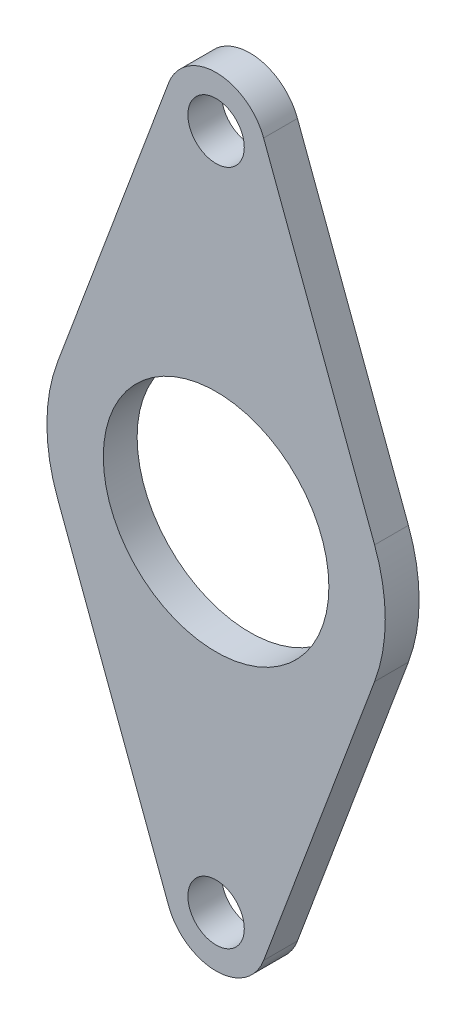
ISO-10303-21;
HEADER;
FILE_DESCRIPTION(('STEP AP214'),'2;1');
FILE_NAME('part.step','',(''),(''),'','','');
FILE_SCHEMA(('AUTOMOTIVE_DESIGN { 1 0 10303 214 1 1 1 1 }'));
ENDSEC;
DATA;
#1=APPLICATION_CONTEXT('core data for automotive mechanical design processes');
#2=APPLICATION_PROTOCOL_DEFINITION('international standard','automotive_design',2000,#1);
#3=PRODUCT_CONTEXT('',#1,'mechanical');
#4=PRODUCT('Part','Part','',(#3));
#5=PRODUCT_RELATED_PRODUCT_CATEGORY('part','',(#4));
#6=PRODUCT_DEFINITION_FORMATION('','',#4);
#7=PRODUCT_DEFINITION_CONTEXT('part definition',#1,'design');
#8=PRODUCT_DEFINITION('design','',#6,#7);
#9=PRODUCT_DEFINITION_SHAPE('','',#8);
#10=(LENGTH_UNIT() NAMED_UNIT(*) SI_UNIT(.MILLI.,.METRE.));
#11=(NAMED_UNIT(*) PLANE_ANGLE_UNIT() SI_UNIT($,.RADIAN.));
#12=(NAMED_UNIT(*) SI_UNIT($,.STERADIAN.) SOLID_ANGLE_UNIT());
#13=UNCERTAINTY_MEASURE_WITH_UNIT(LENGTH_MEASURE(1.E-05),#10,'distance_accuracy_value','');
#14=(GEOMETRIC_REPRESENTATION_CONTEXT(3) GLOBAL_UNCERTAINTY_ASSIGNED_CONTEXT((#13)) GLOBAL_UNIT_ASSIGNED_CONTEXT((#10,
#11,#12)) REPRESENTATION_CONTEXT('',''));
#15=CARTESIAN_POINT('',(0.,0.,0.));
#16=DIRECTION('',(0.,0.,1.));
#17=DIRECTION('',(1.,0.,0.));
#18=AXIS2_PLACEMENT_3D('',#15,#16,#17);
#19=CARTESIAN_POINT('',(0.,-30.,3.));
#20=DIRECTION('',(0.,0.,1.));
#21=DIRECTION('',(1.,0.,0.));
#22=AXIS2_PLACEMENT_3D('',#19,#20,#21);
#23=PLANE('',#22);
#24=CARTESIAN_POINT('',(0.,-30.,3.));
#25=DIRECTION('',(0.,0.,1.));
#26=DIRECTION('',(1.,0.,0.));
#27=AXIS2_PLACEMENT_3D('',#24,#25,#26);
#28=CIRCLE('',#27,2.5);
#29=CARTESIAN_POINT('',(2.5,-30.,3.));
#30=VERTEX_POINT('',#29);
#31=EDGE_CURVE('E184',#30,#30,#28,.T.);
#32=ORIENTED_EDGE('',*,*,#31,.F.);
#33=EDGE_LOOP('',(#32));
#34=FACE_BOUND('',#33,.T.);
#35=CARTESIAN_POINT('',(0.,-30.,3.));
#36=DIRECTION('',(0.,0.,1.));
#37=DIRECTION('',(1.,0.,0.));
#38=AXIS2_PLACEMENT_3D('',#35,#36,#37);
#39=CIRCLE('',#38,4.5);
#40=CARTESIAN_POINT('',(-4.21537364891892,-31.575,3.));
#41=VERTEX_POINT('',#40);
#42=CARTESIAN_POINT('',(4.21537364891892,-31.575,3.));
#43=VERTEX_POINT('',#42);
#44=EDGE_CURVE('E147',#41,#43,#39,.T.);
#45=ORIENTED_EDGE('',*,*,#44,.T.);
#46=DIRECTION('',(0.35,0.93674969975976,0.));
#47=VECTOR('',#46,1.);
#48=CARTESIAN_POINT('',(4.21537364891892,-31.575,3.));
#49=LINE('',#48,#47);
#50=CARTESIAN_POINT('',(14.0512454963964,-5.25,3.));
#51=VERTEX_POINT('',#50);
#52=EDGE_CURVE('E95',#43,#51,#49,.T.);
#53=ORIENTED_EDGE('',*,*,#52,.T.);
#54=CARTESIAN_POINT('',(0.,0.,3.));
#55=DIRECTION('',(0.,0.,1.));
#56=DIRECTION('',(1.,0.,0.));
#57=AXIS2_PLACEMENT_3D('',#54,#55,#56);
#58=CIRCLE('',#57,15.);
#59=CARTESIAN_POINT('',(14.0512454963964,5.25,3.));
#60=VERTEX_POINT('',#59);
#61=EDGE_CURVE('E162',#51,#60,#58,.T.);
#62=ORIENTED_EDGE('',*,*,#61,.T.);
#63=DIRECTION('',(-0.35,0.93674969975976,0.));
#64=VECTOR('',#63,1.);
#65=CARTESIAN_POINT('',(4.21537364891892,31.575,3.));
#66=LINE('',#65,#64);
#67=CARTESIAN_POINT('',(4.21537364891892,31.575,3.));
#68=VERTEX_POINT('',#67);
#69=EDGE_CURVE('E175',#60,#68,#66,.T.);
#70=ORIENTED_EDGE('',*,*,#69,.T.);
#71=CARTESIAN_POINT('',(0.,30.,3.));
#72=DIRECTION('',(0.,0.,1.));
#73=DIRECTION('',(1.,0.,0.));
#74=AXIS2_PLACEMENT_3D('',#71,#72,#73);
#75=CIRCLE('',#74,4.5);
#76=CARTESIAN_POINT('',(-4.21537364891891,31.575,3.));
#77=VERTEX_POINT('',#76);
#78=EDGE_CURVE('E114',#68,#77,#75,.T.);
#79=ORIENTED_EDGE('',*,*,#78,.T.);
#80=DIRECTION('',(-0.35,-0.93674969975976,0.));
#81=VECTOR('',#80,1.);
#82=CARTESIAN_POINT('',(-4.21537364891892,31.575,3.));
#83=LINE('',#82,#81);
#84=CARTESIAN_POINT('',(-14.0512454963964,5.25,3.));
#85=VERTEX_POINT('',#84);
#86=EDGE_CURVE('E108',#77,#85,#83,.T.);
#87=ORIENTED_EDGE('',*,*,#86,.T.);
#88=CARTESIAN_POINT('',(0.,0.,3.));
#89=DIRECTION('',(0.,0.,1.));
#90=DIRECTION('',(1.,0.,0.));
#91=AXIS2_PLACEMENT_3D('',#88,#89,#90);
#92=CIRCLE('',#91,15.);
#93=CARTESIAN_POINT('',(-14.0512454963964,-5.24999999999999,3.));
#94=VERTEX_POINT('',#93);
#95=EDGE_CURVE('E112',#85,#94,#92,.T.);
#96=ORIENTED_EDGE('',*,*,#95,.T.);
#97=DIRECTION('',(0.35,-0.93674969975976,0.));
#98=VECTOR('',#97,1.);
#99=CARTESIAN_POINT('',(-4.21537364891892,-31.575,3.));
#100=LINE('',#99,#98);
#101=EDGE_CURVE('E52',#94,#41,#100,.T.);
#102=ORIENTED_EDGE('',*,*,#101,.T.);
#103=EDGE_LOOP('',(#45,#53,#62,#70,#79,#87,#96,#102));
#104=FACE_BOUND('',#103,.T.);
#105=CARTESIAN_POINT('',(0.,30.,3.));
#106=DIRECTION('',(0.,0.,1.));
#107=DIRECTION('',(1.,0.,0.));
#108=AXIS2_PLACEMENT_3D('',#105,#106,#107);
#109=CIRCLE('',#108,2.5);
#110=CARTESIAN_POINT('',(2.50000000000001,30.,3.));
#111=VERTEX_POINT('',#110);
#112=EDGE_CURVE('E136',#111,#111,#109,.T.);
#113=ORIENTED_EDGE('',*,*,#112,.F.);
#114=EDGE_LOOP('',(#113));
#115=FACE_BOUND('',#114,.T.);
#116=CARTESIAN_POINT('',(0.,0.,3.));
#117=DIRECTION('',(0.,0.,1.));
#118=DIRECTION('',(1.,0.,0.));
#119=AXIS2_PLACEMENT_3D('',#116,#117,#118);
#120=CIRCLE('',#119,10.);
#121=CARTESIAN_POINT('',(10.,0.,3.));
#122=VERTEX_POINT('',#121);
#123=EDGE_CURVE('E190',#122,#122,#120,.T.);
#124=ORIENTED_EDGE('',*,*,#123,.F.);
#125=EDGE_LOOP('',(#124));
#126=FACE_BOUND('',#125,.T.);
#127=ADVANCED_FACE('F35',(#34,#104,#115,#126),#23,.T.);
#128=CARTESIAN_POINT('',(0.,-30.,0.));
#129=DIRECTION('',(0.,0.,1.));
#130=DIRECTION('',(1.,0.,0.));
#131=AXIS2_PLACEMENT_3D('',#128,#129,#130);
#132=PLANE('',#131);
#133=CARTESIAN_POINT('',(0.,-30.,0.));
#134=DIRECTION('',(0.,0.,1.));
#135=DIRECTION('',(1.,0.,0.));
#136=AXIS2_PLACEMENT_3D('',#133,#134,#135);
#137=CIRCLE('',#136,4.5);
#138=CARTESIAN_POINT('',(-4.21537364891892,-31.575,0.));
#139=VERTEX_POINT('',#138);
#140=CARTESIAN_POINT('',(4.21537364891892,-31.575,0.));
#141=VERTEX_POINT('',#140);
#142=EDGE_CURVE('E132',#139,#141,#137,.T.);
#143=ORIENTED_EDGE('',*,*,#142,.F.);
#144=DIRECTION('',(0.35,-0.93674969975976,0.));
#145=VECTOR('',#144,1.);
#146=CARTESIAN_POINT('',(-4.21537364891892,-31.575,0.));
#147=LINE('',#146,#145);
#148=CARTESIAN_POINT('',(-14.0512454963964,-5.24999999999999,0.));
#149=VERTEX_POINT('',#148);
#150=EDGE_CURVE('E87',#149,#139,#147,.T.);
#151=ORIENTED_EDGE('',*,*,#150,.F.);
#152=CARTESIAN_POINT('',(0.,0.,0.));
#153=DIRECTION('',(0.,0.,1.));
#154=DIRECTION('',(1.,0.,0.));
#155=AXIS2_PLACEMENT_3D('',#152,#153,#154);
#156=CIRCLE('',#155,15.);
#157=CARTESIAN_POINT('',(-14.0512454963964,5.25,0.));
#158=VERTEX_POINT('',#157);
#159=EDGE_CURVE('E81',#158,#149,#156,.T.);
#160=ORIENTED_EDGE('',*,*,#159,.F.);
#161=DIRECTION('',(-0.35,-0.93674969975976,0.));
#162=VECTOR('',#161,1.);
#163=CARTESIAN_POINT('',(-4.21537364891892,31.575,0.));
#164=LINE('',#163,#162);
#165=CARTESIAN_POINT('',(-4.21537364891891,31.575,0.));
#166=VERTEX_POINT('',#165);
#167=EDGE_CURVE('E122',#166,#158,#164,.T.);
#168=ORIENTED_EDGE('',*,*,#167,.F.);
#169=CARTESIAN_POINT('',(0.,30.,0.));
#170=DIRECTION('',(0.,0.,1.));
#171=DIRECTION('',(1.,0.,0.));
#172=AXIS2_PLACEMENT_3D('',#169,#170,#171);
#173=CIRCLE('',#172,4.5);
#174=CARTESIAN_POINT('',(4.21537364891892,31.575,0.));
#175=VERTEX_POINT('',#174);
#176=EDGE_CURVE('E142',#175,#166,#173,.T.);
#177=ORIENTED_EDGE('',*,*,#176,.F.);
#178=DIRECTION('',(-0.35,0.93674969975976,0.));
#179=VECTOR('',#178,1.);
#180=CARTESIAN_POINT('',(4.21537364891892,31.575,0.));
#181=LINE('',#180,#179);
#182=CARTESIAN_POINT('',(14.0512454963964,5.25,0.));
#183=VERTEX_POINT('',#182);
#184=EDGE_CURVE('E140',#183,#175,#181,.T.);
#185=ORIENTED_EDGE('',*,*,#184,.F.);
#186=CARTESIAN_POINT('',(0.,0.,0.));
#187=DIRECTION('',(0.,0.,1.));
#188=DIRECTION('',(1.,0.,0.));
#189=AXIS2_PLACEMENT_3D('',#186,#187,#188);
#190=CIRCLE('',#189,15.);
#191=CARTESIAN_POINT('',(14.0512454963964,-5.25,0.));
#192=VERTEX_POINT('',#191);
#193=EDGE_CURVE('E138',#192,#183,#190,.T.);
#194=ORIENTED_EDGE('',*,*,#193,.F.);
#195=DIRECTION('',(0.35,0.93674969975976,0.));
#196=VECTOR('',#195,1.);
#197=CARTESIAN_POINT('',(4.21537364891892,-31.575,0.));
#198=LINE('',#197,#196);
#199=EDGE_CURVE('E135',#141,#192,#198,.T.);
#200=ORIENTED_EDGE('',*,*,#199,.F.);
#201=EDGE_LOOP('',(#143,#151,#160,#168,#177,#185,#194,#200));
#202=FACE_BOUND('',#201,.T.);
#203=CARTESIAN_POINT('',(0.,30.,0.));
#204=DIRECTION('',(0.,0.,1.));
#205=DIRECTION('',(1.,0.,0.));
#206=AXIS2_PLACEMENT_3D('',#203,#204,#205);
#207=CIRCLE('',#206,2.5);
#208=CARTESIAN_POINT('',(2.50000000000001,30.,0.));
#209=VERTEX_POINT('',#208);
#210=EDGE_CURVE('E181',#209,#209,#207,.T.);
#211=ORIENTED_EDGE('',*,*,#210,.T.);
#212=EDGE_LOOP('',(#211));
#213=FACE_BOUND('',#212,.T.);
#214=CARTESIAN_POINT('',(0.,-30.,0.));
#215=DIRECTION('',(0.,0.,1.));
#216=DIRECTION('',(1.,0.,0.));
#217=AXIS2_PLACEMENT_3D('',#214,#215,#216);
#218=CIRCLE('',#217,2.5);
#219=CARTESIAN_POINT('',(2.5,-30.,0.));
#220=VERTEX_POINT('',#219);
#221=EDGE_CURVE('E187',#220,#220,#218,.T.);
#222=ORIENTED_EDGE('',*,*,#221,.T.);
#223=EDGE_LOOP('',(#222));
#224=FACE_BOUND('',#223,.T.);
#225=CARTESIAN_POINT('',(0.,0.,0.));
#226=DIRECTION('',(0.,0.,1.));
#227=DIRECTION('',(1.,0.,0.));
#228=AXIS2_PLACEMENT_3D('',#225,#226,#227);
#229=CIRCLE('',#228,10.);
#230=CARTESIAN_POINT('',(10.,0.,0.));
#231=VERTEX_POINT('',#230);
#232=EDGE_CURVE('E193',#231,#231,#229,.T.);
#233=ORIENTED_EDGE('',*,*,#232,.T.);
#234=EDGE_LOOP('',(#233));
#235=FACE_BOUND('',#234,.T.);
#236=ADVANCED_FACE('F166',(#202,#213,#224,#235),#132,.F.);
#237=CARTESIAN_POINT('',(0.,-30.,3.));
#238=DIRECTION('',(0.,0.,-1.));
#239=DIRECTION('',(-1.,0.,0.));
#240=AXIS2_PLACEMENT_3D('',#237,#238,#239);
#241=CYLINDRICAL_SURFACE('',#240,4.5);
#242=ORIENTED_EDGE('',*,*,#142,.T.);
#243=DIRECTION('',(0.,0.,-1.));
#244=VECTOR('',#243,1.);
#245=CARTESIAN_POINT('',(4.21537364891892,-31.575,3.));
#246=LINE('',#245,#244);
#247=EDGE_CURVE('E11',#43,#141,#246,.T.);
#248=ORIENTED_EDGE('',*,*,#247,.F.);
#249=ORIENTED_EDGE('',*,*,#44,.F.);
#250=DIRECTION('',(0.,0.,-1.));
#251=VECTOR('',#250,1.);
#252=CARTESIAN_POINT('',(-4.21537364891892,-31.575,3.));
#253=LINE('',#252,#251);
#254=EDGE_CURVE('E128',#41,#139,#253,.T.);
#255=ORIENTED_EDGE('',*,*,#254,.T.);
#256=EDGE_LOOP('',(#242,#248,#249,#255));
#257=FACE_BOUND('',#256,.T.);
#258=ADVANCED_FACE('F37',(#257),#241,.T.);
#259=CARTESIAN_POINT('',(4.21537364891892,-31.575,3.));
#260=DIRECTION('',(-0.93674969975976,0.35,0.));
#261=DIRECTION('',(-0.35,-0.93674969975976,0.));
#262=AXIS2_PLACEMENT_3D('',#259,#260,#261);
#263=PLANE('',#262);
#264=ORIENTED_EDGE('',*,*,#199,.T.);
#265=DIRECTION('',(0.,0.,-1.));
#266=VECTOR('',#265,1.);
#267=CARTESIAN_POINT('',(14.0512454963964,-5.25,3.));
#268=LINE('',#267,#266);
#269=EDGE_CURVE('E44',#51,#192,#268,.T.);
#270=ORIENTED_EDGE('',*,*,#269,.F.);
#271=ORIENTED_EDGE('',*,*,#52,.F.);
#272=ORIENTED_EDGE('',*,*,#247,.T.);
#273=EDGE_LOOP('',(#264,#270,#271,#272));
#274=FACE_BOUND('',#273,.T.);
#275=ADVANCED_FACE('F226',(#274),#263,.F.);
#276=CARTESIAN_POINT('',(0.,0.,3.));
#277=DIRECTION('',(0.,0.,-1.));
#278=DIRECTION('',(-1.,0.,0.));
#279=AXIS2_PLACEMENT_3D('',#276,#277,#278);
#280=CYLINDRICAL_SURFACE('',#279,15.);
#281=ORIENTED_EDGE('',*,*,#193,.T.);
#282=DIRECTION('',(0.,0.,-1.));
#283=VECTOR('',#282,1.);
#284=CARTESIAN_POINT('',(14.0512454963964,5.25,3.));
#285=LINE('',#284,#283);
#286=EDGE_CURVE('E154',#60,#183,#285,.T.);
#287=ORIENTED_EDGE('',*,*,#286,.F.);
#288=ORIENTED_EDGE('',*,*,#61,.F.);
#289=ORIENTED_EDGE('',*,*,#269,.T.);
#290=EDGE_LOOP('',(#281,#287,#288,#289));
#291=FACE_BOUND('',#290,.T.);
#292=ADVANCED_FACE('F160',(#291),#280,.T.);
#293=CARTESIAN_POINT('',(4.21537364891892,31.575,3.));
#294=DIRECTION('',(-0.93674969975976,-0.35,0.));
#295=DIRECTION('',(0.35,-0.93674969975976,0.));
#296=AXIS2_PLACEMENT_3D('',#293,#294,#295);
#297=PLANE('',#296);
#298=ORIENTED_EDGE('',*,*,#184,.T.);
#299=DIRECTION('',(0.,0.,-1.));
#300=VECTOR('',#299,1.);
#301=CARTESIAN_POINT('',(4.21537364891892,31.575,3.));
#302=LINE('',#301,#300);
#303=EDGE_CURVE('E151',#68,#175,#302,.T.);
#304=ORIENTED_EDGE('',*,*,#303,.F.);
#305=ORIENTED_EDGE('',*,*,#69,.F.);
#306=ORIENTED_EDGE('',*,*,#286,.T.);
#307=EDGE_LOOP('',(#298,#304,#305,#306));
#308=FACE_BOUND('',#307,.T.);
#309=ADVANCED_FACE('F171',(#308),#297,.F.);
#310=CARTESIAN_POINT('',(0.,30.,3.));
#311=DIRECTION('',(0.,0.,-1.));
#312=DIRECTION('',(-1.,0.,0.));
#313=AXIS2_PLACEMENT_3D('',#310,#311,#312);
#314=CYLINDRICAL_SURFACE('',#313,4.5);
#315=ORIENTED_EDGE('',*,*,#176,.T.);
#316=DIRECTION('',(0.,0.,-1.));
#317=VECTOR('',#316,1.);
#318=CARTESIAN_POINT('',(-4.21537364891891,31.575,3.));
#319=LINE('',#318,#317);
#320=EDGE_CURVE('E123',#77,#166,#319,.T.);
#321=ORIENTED_EDGE('',*,*,#320,.F.);
#322=ORIENTED_EDGE('',*,*,#78,.F.);
#323=ORIENTED_EDGE('',*,*,#303,.T.);
#324=EDGE_LOOP('',(#315,#321,#322,#323));
#325=FACE_BOUND('',#324,.T.);
#326=ADVANCED_FACE('F174',(#325),#314,.T.);
#327=CARTESIAN_POINT('',(-4.21537364891892,31.575,3.));
#328=DIRECTION('',(0.93674969975976,-0.35,0.));
#329=DIRECTION('',(0.35,0.93674969975976,0.));
#330=AXIS2_PLACEMENT_3D('',#327,#328,#329);
#331=PLANE('',#330);
#332=ORIENTED_EDGE('',*,*,#167,.T.);
#333=DIRECTION('',(0.,0.,-1.));
#334=VECTOR('',#333,1.);
#335=CARTESIAN_POINT('',(-14.0512454963964,5.25,3.));
#336=LINE('',#335,#334);
#337=EDGE_CURVE('E119',#85,#158,#336,.T.);
#338=ORIENTED_EDGE('',*,*,#337,.F.);
#339=ORIENTED_EDGE('',*,*,#86,.F.);
#340=ORIENTED_EDGE('',*,*,#320,.T.);
#341=EDGE_LOOP('',(#332,#338,#339,#340));
#342=FACE_BOUND('',#341,.T.);
#343=ADVANCED_FACE('F120',(#342),#331,.F.);
#344=CARTESIAN_POINT('',(0.,0.,3.));
#345=DIRECTION('',(0.,0.,-1.));
#346=DIRECTION('',(-1.,0.,0.));
#347=AXIS2_PLACEMENT_3D('',#344,#345,#346);
#348=CYLINDRICAL_SURFACE('',#347,15.);
#349=ORIENTED_EDGE('',*,*,#159,.T.);
#350=DIRECTION('',(0.,0.,-1.));
#351=VECTOR('',#350,1.);
#352=CARTESIAN_POINT('',(-14.0512454963964,-5.24999999999999,3.));
#353=LINE('',#352,#351);
#354=EDGE_CURVE('E124',#94,#149,#353,.T.);
#355=ORIENTED_EDGE('',*,*,#354,.F.);
#356=ORIENTED_EDGE('',*,*,#95,.F.);
#357=ORIENTED_EDGE('',*,*,#337,.T.);
#358=EDGE_LOOP('',(#349,#355,#356,#357));
#359=FACE_BOUND('',#358,.T.);
#360=ADVANCED_FACE('F126',(#359),#348,.T.);
#361=CARTESIAN_POINT('',(-4.21537364891892,-31.575,3.));
#362=DIRECTION('',(0.93674969975976,0.35,0.));
#363=DIRECTION('',(-0.35,0.93674969975976,0.));
#364=AXIS2_PLACEMENT_3D('',#361,#362,#363);
#365=PLANE('',#364);
#366=ORIENTED_EDGE('',*,*,#150,.T.);
#367=ORIENTED_EDGE('',*,*,#254,.F.);
#368=ORIENTED_EDGE('',*,*,#101,.F.);
#369=ORIENTED_EDGE('',*,*,#354,.T.);
#370=EDGE_LOOP('',(#366,#367,#368,#369));
#371=FACE_BOUND('',#370,.T.);
#372=ADVANCED_FACE('F214',(#371),#365,.F.);
#373=CARTESIAN_POINT('',(0.,30.,3.));
#374=DIRECTION('',(0.,0.,-1.));
#375=DIRECTION('',(-1.,0.,0.));
#376=AXIS2_PLACEMENT_3D('',#373,#374,#375);
#377=CYLINDRICAL_SURFACE('',#376,2.5);
#378=ORIENTED_EDGE('',*,*,#112,.T.);
#379=EDGE_LOOP('',(#378));
#380=FACE_BOUND('',#379,.T.);
#381=ORIENTED_EDGE('',*,*,#210,.F.);
#382=EDGE_LOOP('',(#381));
#383=FACE_BOUND('',#382,.T.);
#384=ADVANCED_FACE('F211',(#380,#383),#377,.F.);
#385=CARTESIAN_POINT('',(0.,-30.,3.));
#386=DIRECTION('',(0.,0.,-1.));
#387=DIRECTION('',(-1.,0.,0.));
#388=AXIS2_PLACEMENT_3D('',#385,#386,#387);
#389=CYLINDRICAL_SURFACE('',#388,2.5);
#390=ORIENTED_EDGE('',*,*,#31,.T.);
#391=EDGE_LOOP('',(#390));
#392=FACE_BOUND('',#391,.T.);
#393=ORIENTED_EDGE('',*,*,#221,.F.);
#394=EDGE_LOOP('',(#393));
#395=FACE_BOUND('',#394,.T.);
#396=ADVANCED_FACE('F290',(#392,#395),#389,.F.);
#397=CARTESIAN_POINT('',(0.,0.,3.));
#398=DIRECTION('',(0.,0.,-1.));
#399=DIRECTION('',(-1.,0.,0.));
#400=AXIS2_PLACEMENT_3D('',#397,#398,#399);
#401=CYLINDRICAL_SURFACE('',#400,10.);
#402=ORIENTED_EDGE('',*,*,#123,.T.);
#403=EDGE_LOOP('',(#402));
#404=FACE_BOUND('',#403,.T.);
#405=ORIENTED_EDGE('',*,*,#232,.F.);
#406=EDGE_LOOP('',(#405));
#407=FACE_BOUND('',#406,.T.);
#408=ADVANCED_FACE('F199',(#404,#407),#401,.F.);
#409=CLOSED_SHELL('',(#127,#236,#258,#275,#292,#309,#326,#343,#360,#372,#384,#396,#408));
#410=MANIFOLD_SOLID_BREP('B2',#409);
#411=ADVANCED_BREP_SHAPE_REPRESENTATION('',(#18,#410),#14);
#412=SHAPE_DEFINITION_REPRESENTATION(#9,#411);
ENDSEC;
END-ISO-10303-21;
